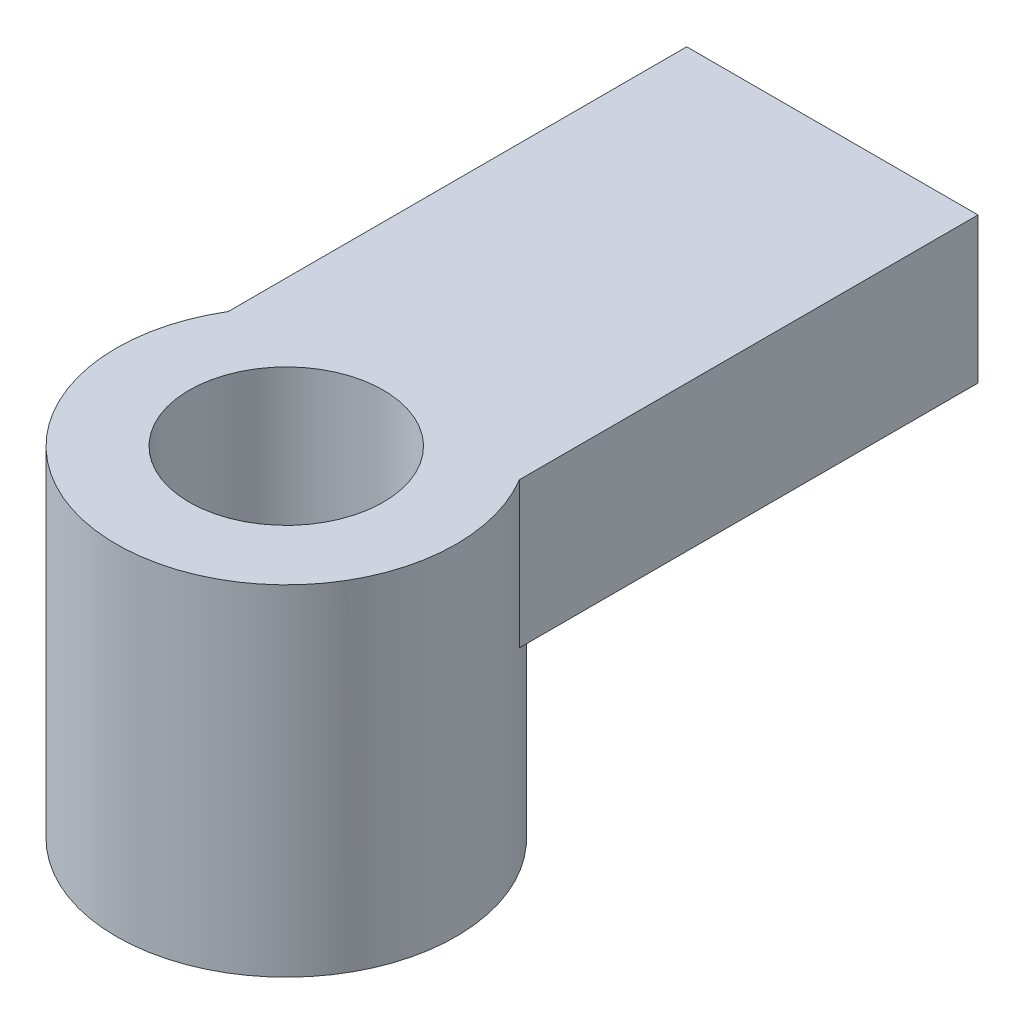
ISO-10303-21;
HEADER;
FILE_DESCRIPTION(('STEP AP214'),'2;1');
FILE_NAME('part.step','',(''),(''),'','','');
FILE_SCHEMA(('AUTOMOTIVE_DESIGN { 1 0 10303 214 1 1 1 1 }'));
ENDSEC;
DATA;
#1=APPLICATION_CONTEXT('core data for automotive mechanical design processes');
#2=APPLICATION_PROTOCOL_DEFINITION('international standard','automotive_design',2000,#1);
#3=PRODUCT_CONTEXT('',#1,'mechanical');
#4=PRODUCT('Part','Part','',(#3));
#5=PRODUCT_RELATED_PRODUCT_CATEGORY('part','',(#4));
#6=PRODUCT_DEFINITION_FORMATION('','',#4);
#7=PRODUCT_DEFINITION_CONTEXT('part definition',#1,'design');
#8=PRODUCT_DEFINITION('design','',#6,#7);
#9=PRODUCT_DEFINITION_SHAPE('','',#8);
#10=(LENGTH_UNIT() NAMED_UNIT(*) SI_UNIT(.MILLI.,.METRE.));
#11=(NAMED_UNIT(*) PLANE_ANGLE_UNIT() SI_UNIT($,.RADIAN.));
#12=(NAMED_UNIT(*) SI_UNIT($,.STERADIAN.) SOLID_ANGLE_UNIT());
#13=UNCERTAINTY_MEASURE_WITH_UNIT(LENGTH_MEASURE(1.E-05),#10,'distance_accuracy_value','');
#14=(GEOMETRIC_REPRESENTATION_CONTEXT(3) GLOBAL_UNCERTAINTY_ASSIGNED_CONTEXT((#13)) GLOBAL_UNIT_ASSIGNED_CONTEXT((#10,
#11,#12)) REPRESENTATION_CONTEXT('',''));
#15=CARTESIAN_POINT('',(0.,0.,0.));
#16=DIRECTION('',(0.,0.,1.));
#17=DIRECTION('',(1.,0.,0.));
#18=AXIS2_PLACEMENT_3D('',#15,#16,#17);
#19=CARTESIAN_POINT('',(0.,56.,0.));
#20=DIRECTION('',(0.,-1.,0.));
#21=DIRECTION('',(0.,0.,-1.));
#22=AXIS2_PLACEMENT_3D('',#19,#20,#21);
#23=CYLINDRICAL_SURFACE('',#22,28.);
#24=CARTESIAN_POINT('',(0.,0.,0.));
#25=DIRECTION('',(0.,1.,0.));
#26=DIRECTION('',(0.,0.,1.));
#27=AXIS2_PLACEMENT_3D('',#24,#25,#26);
#28=CIRCLE('',#27,28.);
#29=CARTESIAN_POINT('',(0.,0.,28.));
#30=VERTEX_POINT('',#29);
#31=EDGE_CURVE('E106',#30,#30,#28,.T.);
#32=ORIENTED_EDGE('',*,*,#31,.T.);
#33=EDGE_LOOP('',(#32));
#34=FACE_BOUND('',#33,.T.);
#35=DIRECTION('',(0.,1.,0.));
#36=VECTOR('',#35,1.);
#37=CARTESIAN_POINT('',(-24.,32.,-14.422205101856));
#38=LINE('',#37,#36);
#39=CARTESIAN_POINT('',(-24.,32.,-14.422205101856));
#40=VERTEX_POINT('',#39);
#41=CARTESIAN_POINT('',(-24.,56.,-14.422205101856));
#42=VERTEX_POINT('',#41);
#43=EDGE_CURVE('E120',#40,#42,#38,.T.);
#44=ORIENTED_EDGE('',*,*,#43,.F.);
#45=CARTESIAN_POINT('',(0.,32.,0.));
#46=DIRECTION('',(0.,-1.,0.));
#47=DIRECTION('',(0.,0.,1.));
#48=AXIS2_PLACEMENT_3D('',#45,#46,#47);
#49=CIRCLE('',#48,28.);
#50=CARTESIAN_POINT('',(24.,32.,-14.422205101856));
#51=VERTEX_POINT('',#50);
#52=EDGE_CURVE('E58',#40,#51,#49,.T.);
#53=ORIENTED_EDGE('',*,*,#52,.T.);
#54=DIRECTION('',(0.,1.,0.));
#55=VECTOR('',#54,1.);
#56=CARTESIAN_POINT('',(24.,32.,-14.422205101856));
#57=LINE('',#56,#55);
#58=CARTESIAN_POINT('',(24.,56.,-14.422205101856));
#59=VERTEX_POINT('',#58);
#60=EDGE_CURVE('E124',#51,#59,#57,.T.);
#61=ORIENTED_EDGE('',*,*,#60,.T.);
#62=CARTESIAN_POINT('',(0.,56.,0.));
#63=DIRECTION('',(0.,1.,0.));
#64=DIRECTION('',(0.,0.,1.));
#65=AXIS2_PLACEMENT_3D('',#62,#63,#64);
#66=CIRCLE('',#65,28.);
#67=EDGE_CURVE('E91',#42,#59,#66,.T.);
#68=ORIENTED_EDGE('',*,*,#67,.F.);
#69=EDGE_LOOP('',(#44,#53,#61,#68));
#70=FACE_BOUND('',#69,.T.);
#71=ADVANCED_FACE('F39',(#34,#70),#23,.T.);
#72=CARTESIAN_POINT('',(0.,56.,0.));
#73=DIRECTION('',(0.,1.,0.));
#74=DIRECTION('',(0.,0.,1.));
#75=AXIS2_PLACEMENT_3D('',#72,#73,#74);
#76=PLANE('',#75);
#77=ORIENTED_EDGE('',*,*,#67,.T.);
#78=DIRECTION('',(0.,0.,-1.));
#79=VECTOR('',#78,1.);
#80=CARTESIAN_POINT('',(24.,56.,-90.));
#81=LINE('',#80,#79);
#82=CARTESIAN_POINT('',(24.,56.,-90.));
#83=VERTEX_POINT('',#82);
#84=EDGE_CURVE('E134',#59,#83,#81,.T.);
#85=ORIENTED_EDGE('',*,*,#84,.T.);
#86=DIRECTION('',(-1.,0.,0.));
#87=VECTOR('',#86,1.);
#88=CARTESIAN_POINT('',(-24.,56.,-90.));
#89=LINE('',#88,#87);
#90=CARTESIAN_POINT('',(-24.,56.,-90.));
#91=VERTEX_POINT('',#90);
#92=EDGE_CURVE('E130',#83,#91,#89,.T.);
#93=ORIENTED_EDGE('',*,*,#92,.T.);
#94=DIRECTION('',(0.,0.,1.));
#95=VECTOR('',#94,1.);
#96=CARTESIAN_POINT('',(-24.,56.,-90.));
#97=LINE('',#96,#95);
#98=EDGE_CURVE('E98',#91,#42,#97,.T.);
#99=ORIENTED_EDGE('',*,*,#98,.T.);
#100=EDGE_LOOP('',(#77,#85,#93,#99));
#101=FACE_BOUND('',#100,.T.);
#102=CARTESIAN_POINT('',(0.,56.,0.));
#103=DIRECTION('',(0.,1.,0.));
#104=DIRECTION('',(0.,0.,1.));
#105=AXIS2_PLACEMENT_3D('',#102,#103,#104);
#106=CIRCLE('',#105,16.);
#107=CARTESIAN_POINT('',(0.,56.,16.));
#108=VERTEX_POINT('',#107);
#109=EDGE_CURVE('E108',#108,#108,#106,.T.);
#110=ORIENTED_EDGE('',*,*,#109,.F.);
#111=EDGE_LOOP('',(#110));
#112=FACE_BOUND('',#111,.T.);
#113=ADVANCED_FACE('F160',(#101,#112),#76,.T.);
#114=CARTESIAN_POINT('',(0.,0.,0.));
#115=DIRECTION('',(0.,1.,0.));
#116=DIRECTION('',(0.,0.,1.));
#117=AXIS2_PLACEMENT_3D('',#114,#115,#116);
#118=PLANE('',#117);
#119=ORIENTED_EDGE('',*,*,#31,.F.);
#120=EDGE_LOOP('',(#119));
#121=FACE_BOUND('',#120,.T.);
#122=CARTESIAN_POINT('',(0.,0.,0.));
#123=DIRECTION('',(0.,1.,0.));
#124=DIRECTION('',(0.,0.,1.));
#125=AXIS2_PLACEMENT_3D('',#122,#123,#124);
#126=CIRCLE('',#125,16.);
#127=CARTESIAN_POINT('',(0.,0.,16.));
#128=VERTEX_POINT('',#127);
#129=EDGE_CURVE('E115',#128,#128,#126,.T.);
#130=ORIENTED_EDGE('',*,*,#129,.T.);
#131=EDGE_LOOP('',(#130));
#132=FACE_BOUND('',#131,.T.);
#133=ADVANCED_FACE('F164',(#121,#132),#118,.F.);
#134=CARTESIAN_POINT('',(0.,56.,0.));
#135=DIRECTION('',(0.,-1.,0.));
#136=DIRECTION('',(0.,0.,-1.));
#137=AXIS2_PLACEMENT_3D('',#134,#135,#136);
#138=CYLINDRICAL_SURFACE('',#137,16.);
#139=ORIENTED_EDGE('',*,*,#109,.T.);
#140=EDGE_LOOP('',(#139));
#141=FACE_BOUND('',#140,.T.);
#142=ORIENTED_EDGE('',*,*,#129,.F.);
#143=EDGE_LOOP('',(#142));
#144=FACE_BOUND('',#143,.T.);
#145=ADVANCED_FACE('F174',(#141,#144),#138,.F.);
#146=CARTESIAN_POINT('',(-24.,32.,-90.));
#147=DIRECTION('',(-1.,0.,0.));
#148=DIRECTION('',(0.,0.,1.));
#149=AXIS2_PLACEMENT_3D('',#146,#147,#148);
#150=PLANE('',#149);
#151=ORIENTED_EDGE('',*,*,#98,.F.);
#152=DIRECTION('',(0.,1.,0.));
#153=VECTOR('',#152,1.);
#154=CARTESIAN_POINT('',(-24.,32.,-90.));
#155=LINE('',#154,#153);
#156=CARTESIAN_POINT('',(-24.,32.,-90.));
#157=VERTEX_POINT('',#156);
#158=EDGE_CURVE('E113',#157,#91,#155,.T.);
#159=ORIENTED_EDGE('',*,*,#158,.F.);
#160=DIRECTION('',(0.,0.,1.));
#161=VECTOR('',#160,1.);
#162=CARTESIAN_POINT('',(-24.,32.,-90.));
#163=LINE('',#162,#161);
#164=EDGE_CURVE('E128',#157,#40,#163,.T.);
#165=ORIENTED_EDGE('',*,*,#164,.T.);
#166=ORIENTED_EDGE('',*,*,#43,.T.);
#167=EDGE_LOOP('',(#151,#159,#165,#166));
#168=FACE_BOUND('',#167,.T.);
#169=ADVANCED_FACE('F154',(#168),#150,.T.);
#170=CARTESIAN_POINT('',(-24.,32.,-90.));
#171=DIRECTION('',(0.,0.,-1.));
#172=DIRECTION('',(-1.,0.,0.));
#173=AXIS2_PLACEMENT_3D('',#170,#171,#172);
#174=PLANE('',#173);
#175=CARTESIAN_POINT('',(0.,32.,-90.));
#176=DIRECTION('',(0.,0.,-1.));
#177=DIRECTION('',(-1.,0.,0.));
#178=AXIS2_PLACEMENT_3D('',#175,#176,#177);
#179=CIRCLE('',#178,16.);
#180=CARTESIAN_POINT('',(-16.,32.,-90.));
#181=VERTEX_POINT('',#180);
#182=CARTESIAN_POINT('',(16.,32.,-90.));
#183=VERTEX_POINT('',#182);
#184=EDGE_CURVE('E97',#181,#183,#179,.T.);
#185=ORIENTED_EDGE('',*,*,#184,.F.);
#186=DIRECTION('',(-1.,0.,0.));
#187=VECTOR('',#186,1.);
#188=CARTESIAN_POINT('',(-24.,32.,-90.));
#189=LINE('',#188,#187);
#190=EDGE_CURVE('E102',#181,#157,#189,.T.);
#191=ORIENTED_EDGE('',*,*,#190,.T.);
#192=ORIENTED_EDGE('',*,*,#158,.T.);
#193=ORIENTED_EDGE('',*,*,#92,.F.);
#194=DIRECTION('',(0.,1.,0.));
#195=VECTOR('',#194,1.);
#196=CARTESIAN_POINT('',(24.,32.,-90.));
#197=LINE('',#196,#195);
#198=CARTESIAN_POINT('',(24.,32.,-90.));
#199=VERTEX_POINT('',#198);
#200=EDGE_CURVE('E123',#199,#83,#197,.T.);
#201=ORIENTED_EDGE('',*,*,#200,.F.);
#202=EDGE_CURVE('E121',#199,#183,#189,.T.);
#203=ORIENTED_EDGE('',*,*,#202,.T.);
#204=EDGE_LOOP('',(#185,#191,#192,#193,#201,#203));
#205=FACE_BOUND('',#204,.T.);
#206=ADVANCED_FACE('F150',(#205),#174,.T.);
#207=CARTESIAN_POINT('',(24.,32.,-90.));
#208=DIRECTION('',(1.,0.,0.));
#209=DIRECTION('',(0.,0.,-1.));
#210=AXIS2_PLACEMENT_3D('',#207,#208,#209);
#211=PLANE('',#210);
#212=ORIENTED_EDGE('',*,*,#84,.F.);
#213=ORIENTED_EDGE('',*,*,#60,.F.);
#214=DIRECTION('',(0.,0.,-1.));
#215=VECTOR('',#214,1.);
#216=CARTESIAN_POINT('',(24.,32.,-90.));
#217=LINE('',#216,#215);
#218=EDGE_CURVE('E140',#51,#199,#217,.T.);
#219=ORIENTED_EDGE('',*,*,#218,.T.);
#220=ORIENTED_EDGE('',*,*,#200,.T.);
#221=EDGE_LOOP('',(#212,#213,#219,#220));
#222=FACE_BOUND('',#221,.T.);
#223=ADVANCED_FACE('F151',(#222),#211,.T.);
#224=CARTESIAN_POINT('',(0.,32.,0.));
#225=DIRECTION('',(0.,1.,0.));
#226=DIRECTION('',(0.,0.,1.));
#227=AXIS2_PLACEMENT_3D('',#224,#225,#226);
#228=PLANE('',#227);
#229=DIRECTION('',(-1.,0.,0.));
#230=VECTOR('',#229,1.);
#231=CARTESIAN_POINT('',(0.,32.,-50.));
#232=LINE('',#231,#230);
#233=CARTESIAN_POINT('',(16.,32.,-50.));
#234=VERTEX_POINT('',#233);
#235=CARTESIAN_POINT('',(-16.,32.,-50.));
#236=VERTEX_POINT('',#235);
#237=EDGE_CURVE('E90',#234,#236,#232,.T.);
#238=ORIENTED_EDGE('',*,*,#237,.F.);
#239=DIRECTION('',(0.,0.,-1.));
#240=VECTOR('',#239,1.);
#241=CARTESIAN_POINT('',(16.,32.,-50.));
#242=LINE('',#241,#240);
#243=EDGE_CURVE('E11',#234,#183,#242,.T.);
#244=ORIENTED_EDGE('',*,*,#243,.T.);
#245=ORIENTED_EDGE('',*,*,#202,.F.);
#246=ORIENTED_EDGE('',*,*,#218,.F.);
#247=ORIENTED_EDGE('',*,*,#52,.F.);
#248=ORIENTED_EDGE('',*,*,#164,.F.);
#249=ORIENTED_EDGE('',*,*,#190,.F.);
#250=DIRECTION('',(0.,0.,-1.));
#251=VECTOR('',#250,1.);
#252=CARTESIAN_POINT('',(-16.,32.,-50.));
#253=LINE('',#252,#251);
#254=EDGE_CURVE('E46',#181,#236,#253,.F.);
#255=ORIENTED_EDGE('',*,*,#254,.T.);
#256=EDGE_LOOP('',(#238,#244,#245,#246,#247,#248,#249,#255));
#257=FACE_BOUND('',#256,.T.);
#258=ADVANCED_FACE('F105',(#257),#228,.F.);
#259=CARTESIAN_POINT('',(0.,32.,-50.));
#260=DIRECTION('',(0.,0.,-1.));
#261=DIRECTION('',(-1.,0.,0.));
#262=AXIS2_PLACEMENT_3D('',#259,#260,#261);
#263=CYLINDRICAL_SURFACE('',#262,16.);
#264=CARTESIAN_POINT('',(0.,32.,-50.));
#265=DIRECTION('',(0.,0.,-1.));
#266=DIRECTION('',(-1.,0.,0.));
#267=AXIS2_PLACEMENT_3D('',#264,#265,#266);
#268=CIRCLE('',#267,16.);
#269=EDGE_CURVE('E55',#236,#234,#268,.T.);
#270=ORIENTED_EDGE('',*,*,#269,.F.);
#271=ORIENTED_EDGE('',*,*,#254,.F.);
#272=ORIENTED_EDGE('',*,*,#184,.T.);
#273=ORIENTED_EDGE('',*,*,#243,.F.);
#274=EDGE_LOOP('',(#270,#271,#272,#273));
#275=FACE_BOUND('',#274,.T.);
#276=ADVANCED_FACE('F96',(#275),#263,.F.);
#277=CARTESIAN_POINT('',(0.,32.,-50.));
#278=DIRECTION('',(0.,0.,-1.));
#279=DIRECTION('',(-1.,0.,0.));
#280=AXIS2_PLACEMENT_3D('',#277,#278,#279);
#281=PLANE('',#280);
#282=ORIENTED_EDGE('',*,*,#237,.T.);
#283=ORIENTED_EDGE('',*,*,#269,.T.);
#284=EDGE_LOOP('',(#282,#283));
#285=FACE_BOUND('',#284,.T.);
#286=ADVANCED_FACE('F89',(#285),#281,.T.);
#287=CLOSED_SHELL('',(#71,#113,#133,#145,#169,#206,#223,#258,#276,#286));
#288=MANIFOLD_SOLID_BREP('B2',#287);
#289=ADVANCED_BREP_SHAPE_REPRESENTATION('',(#18,#288),#14);
#290=SHAPE_DEFINITION_REPRESENTATION(#9,#289);
ENDSEC;
END-ISO-10303-21;
